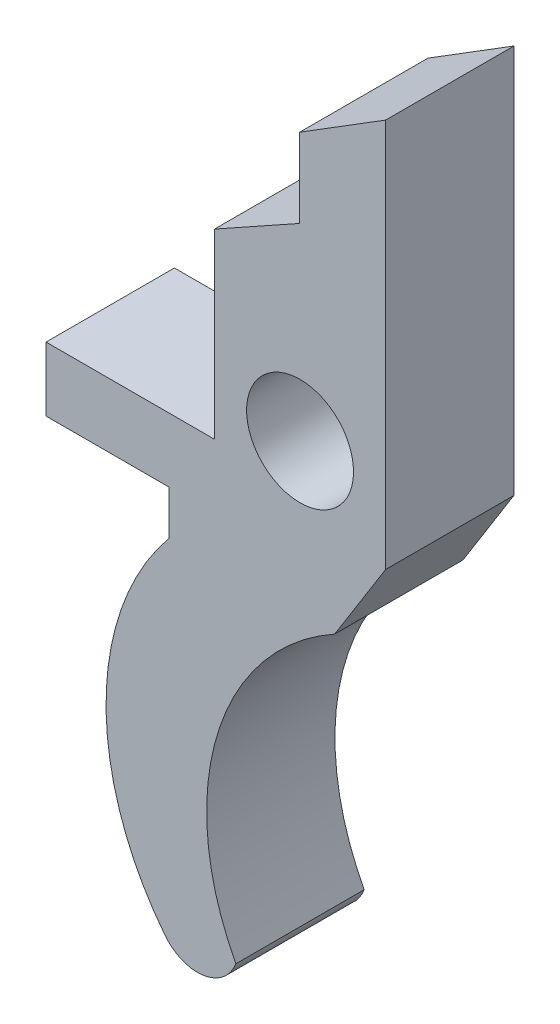
ISO-10303-21;
HEADER;
FILE_DESCRIPTION(('STEP AP214'),'2;1');
FILE_NAME('part.step','',(''),(''),'','','');
FILE_SCHEMA(('AUTOMOTIVE_DESIGN { 1 0 10303 214 1 1 1 1 }'));
ENDSEC;
DATA;
#1=APPLICATION_CONTEXT('core data for automotive mechanical design processes');
#2=APPLICATION_PROTOCOL_DEFINITION('international standard','automotive_design',2000,#1);
#3=PRODUCT_CONTEXT('',#1,'mechanical');
#4=PRODUCT('Part','Part','',(#3));
#5=PRODUCT_RELATED_PRODUCT_CATEGORY('part','',(#4));
#6=PRODUCT_DEFINITION_FORMATION('','',#4);
#7=PRODUCT_DEFINITION_CONTEXT('part definition',#1,'design');
#8=PRODUCT_DEFINITION('design','',#6,#7);
#9=PRODUCT_DEFINITION_SHAPE('','',#8);
#10=(LENGTH_UNIT() NAMED_UNIT(*) SI_UNIT(.MILLI.,.METRE.));
#11=(NAMED_UNIT(*) PLANE_ANGLE_UNIT() SI_UNIT($,.RADIAN.));
#12=(NAMED_UNIT(*) SI_UNIT($,.STERADIAN.) SOLID_ANGLE_UNIT());
#13=UNCERTAINTY_MEASURE_WITH_UNIT(LENGTH_MEASURE(1.E-05),#10,'distance_accuracy_value','');
#14=(GEOMETRIC_REPRESENTATION_CONTEXT(3) GLOBAL_UNCERTAINTY_ASSIGNED_CONTEXT((#13)) GLOBAL_UNIT_ASSIGNED_CONTEXT((#10,
#11,#12)) REPRESENTATION_CONTEXT('',''));
#15=CARTESIAN_POINT('',(0.,0.,0.));
#16=DIRECTION('',(0.,0.,1.));
#17=DIRECTION('',(1.,0.,0.));
#18=AXIS2_PLACEMENT_3D('',#15,#16,#17);
#19=CARTESIAN_POINT('',(4.,0.,6.));
#20=DIRECTION('',(1.,0.,0.));
#21=DIRECTION('',(0.,1.,0.));
#22=AXIS2_PLACEMENT_3D('',#19,#20,#21);
#23=PLANE('',#22);
#24=DIRECTION('',(0.,-1.,0.));
#25=VECTOR('',#24,1.);
#26=CARTESIAN_POINT('',(4.,0.,0.));
#27=LINE('',#26,#25);
#28=CARTESIAN_POINT('',(4.,15.,0.));
#29=VERTEX_POINT('',#28);
#30=CARTESIAN_POINT('',(4.,-3.20232898260396,0.));
#31=VERTEX_POINT('',#30);
#32=EDGE_CURVE('E162',#29,#31,#27,.T.);
#33=ORIENTED_EDGE('',*,*,#32,.F.);
#34=DIRECTION('',(0.,0.,-1.));
#35=VECTOR('',#34,1.);
#36=CARTESIAN_POINT('',(4.,15.,6.));
#37=LINE('',#36,#35);
#38=CARTESIAN_POINT('',(4.,15.,6.));
#39=VERTEX_POINT('',#38);
#40=EDGE_CURVE('E11',#39,#29,#37,.T.);
#41=ORIENTED_EDGE('',*,*,#40,.F.);
#42=DIRECTION('',(0.,-1.,0.));
#43=VECTOR('',#42,1.);
#44=CARTESIAN_POINT('',(4.,0.,6.));
#45=LINE('',#44,#43);
#46=CARTESIAN_POINT('',(4.,-3.20232898260396,6.));
#47=VERTEX_POINT('',#46);
#48=EDGE_CURVE('E199',#39,#47,#45,.T.);
#49=ORIENTED_EDGE('',*,*,#48,.T.);
#50=DIRECTION('',(0.,0.,-1.));
#51=VECTOR('',#50,1.);
#52=CARTESIAN_POINT('',(4.,-3.20232898260396,6.));
#53=LINE('',#52,#51);
#54=EDGE_CURVE('E50',#47,#31,#53,.T.);
#55=ORIENTED_EDGE('',*,*,#54,.T.);
#56=EDGE_LOOP('',(#33,#41,#49,#55));
#57=FACE_BOUND('',#56,.T.);
#58=ADVANCED_FACE('F34',(#57),#23,.T.);
#59=CARTESIAN_POINT('',(-5.61176994680407,9.02018363263467,6.));
#60=DIRECTION('',(-0.528248360907939,0.849089906428098,0.));
#61=DIRECTION('',(-0.849089906428098,-0.528248360907939,0.));
#62=AXIS2_PLACEMENT_3D('',#59,#60,#61);
#63=PLANE('',#62);
#64=DIRECTION('',(0.849089906428098,0.528248360907939,0.));
#65=VECTOR('',#64,1.);
#66=CARTESIAN_POINT('',(-5.61176994680407,9.02018363263467,0.));
#67=LINE('',#66,#65);
#68=CARTESIAN_POINT('',(-0.018657752950472,12.4998532487845,0.));
#69=VERTEX_POINT('',#68);
#70=EDGE_CURVE('E164',#69,#29,#67,.T.);
#71=ORIENTED_EDGE('',*,*,#70,.F.);
#72=DIRECTION('',(0.,0.,-1.));
#73=VECTOR('',#72,1.);
#74=CARTESIAN_POINT('',(-0.018657752950472,12.4998532487845,6.));
#75=LINE('',#74,#73);
#76=CARTESIAN_POINT('',(-0.018657752950472,12.4998532487845,6.));
#77=VERTEX_POINT('',#76);
#78=EDGE_CURVE('E42',#77,#69,#75,.T.);
#79=ORIENTED_EDGE('',*,*,#78,.F.);
#80=DIRECTION('',(0.849089906428098,0.528248360907939,0.));
#81=VECTOR('',#80,1.);
#82=CARTESIAN_POINT('',(-5.61176994680407,9.02018363263467,6.));
#83=LINE('',#82,#81);
#84=EDGE_CURVE('E239',#77,#39,#83,.T.);
#85=ORIENTED_EDGE('',*,*,#84,.T.);
#86=ORIENTED_EDGE('',*,*,#40,.T.);
#87=EDGE_LOOP('',(#71,#79,#85,#86));
#88=FACE_BOUND('',#87,.T.);
#89=ADVANCED_FACE('F226',(#88),#63,.T.);
#90=CARTESIAN_POINT('',(-0.0186577529504716,0.,6.));
#91=DIRECTION('',(-1.,0.,0.));
#92=DIRECTION('',(0.,0.,1.));
#93=AXIS2_PLACEMENT_3D('',#90,#91,#92);
#94=PLANE('',#93);
#95=DIRECTION('',(0.,1.,0.));
#96=VECTOR('',#95,1.);
#97=CARTESIAN_POINT('',(-0.0186577529504716,0.,0.));
#98=LINE('',#97,#96);
#99=CARTESIAN_POINT('',(-0.0186577529504711,8.8049252934806,0.));
#100=VERTEX_POINT('',#99);
#101=EDGE_CURVE('E167',#100,#69,#98,.T.);
#102=ORIENTED_EDGE('',*,*,#101,.F.);
#103=DIRECTION('',(0.,0.,-1.));
#104=VECTOR('',#103,1.);
#105=CARTESIAN_POINT('',(-0.0186577529504711,8.8049252934806,6.));
#106=LINE('',#105,#104);
#107=CARTESIAN_POINT('',(-0.0186577529504711,8.8049252934806,6.));
#108=VERTEX_POINT('',#107);
#109=EDGE_CURVE('E215',#108,#100,#106,.T.);
#110=ORIENTED_EDGE('',*,*,#109,.F.);
#111=DIRECTION('',(0.,1.,0.));
#112=VECTOR('',#111,1.);
#113=CARTESIAN_POINT('',(-0.0186577529504716,0.,6.));
#114=LINE('',#113,#112);
#115=EDGE_CURVE('E222',#108,#77,#114,.T.);
#116=ORIENTED_EDGE('',*,*,#115,.T.);
#117=ORIENTED_EDGE('',*,*,#78,.T.);
#118=EDGE_LOOP('',(#102,#110,#116,#117));
#119=FACE_BOUND('',#118,.T.);
#120=ADVANCED_FACE('F220',(#119),#94,.T.);
#121=CARTESIAN_POINT('',(-3.74872604663077,6.7259671523767,6.));
#122=DIRECTION('',(-0.486841047184989,0.873490580816888,0.));
#123=DIRECTION('',(-0.873490580816888,-0.486841047184989,0.));
#124=AXIS2_PLACEMENT_3D('',#121,#122,#123);
#125=PLANE('',#124);
#126=DIRECTION('',(0.873490580816888,0.486841047184989,0.));
#127=VECTOR('',#126,1.);
#128=CARTESIAN_POINT('',(-3.74872604663077,6.7259671523767,0.));
#129=LINE('',#128,#127);
#130=CARTESIAN_POINT('',(-4.,6.58591930609748,0.));
#131=VERTEX_POINT('',#130);
#132=EDGE_CURVE('E170',#131,#100,#129,.T.);
#133=ORIENTED_EDGE('',*,*,#132,.F.);
#134=DIRECTION('',(0.,0.,-1.));
#135=VECTOR('',#134,1.);
#136=CARTESIAN_POINT('',(-4.,6.58591930609748,6.));
#137=LINE('',#136,#135);
#138=CARTESIAN_POINT('',(-4.,6.58591930609748,6.));
#139=VERTEX_POINT('',#138);
#140=EDGE_CURVE('E213',#139,#131,#137,.T.);
#141=ORIENTED_EDGE('',*,*,#140,.F.);
#142=DIRECTION('',(0.873490580816888,0.486841047184989,0.));
#143=VECTOR('',#142,1.);
#144=CARTESIAN_POINT('',(-3.74872604663077,6.7259671523767,6.));
#145=LINE('',#144,#143);
#146=EDGE_CURVE('E236',#139,#108,#145,.T.);
#147=ORIENTED_EDGE('',*,*,#146,.T.);
#148=ORIENTED_EDGE('',*,*,#109,.T.);
#149=EDGE_LOOP('',(#133,#141,#147,#148));
#150=FACE_BOUND('',#149,.T.);
#151=ADVANCED_FACE('F233',(#150),#125,.T.);
#152=CARTESIAN_POINT('',(-4.,0.,6.));
#153=DIRECTION('',(-1.,0.,0.));
#154=DIRECTION('',(0.,0.,1.));
#155=AXIS2_PLACEMENT_3D('',#152,#153,#154);
#156=PLANE('',#155);
#157=DIRECTION('',(0.,1.,0.));
#158=VECTOR('',#157,1.);
#159=CARTESIAN_POINT('',(-4.,0.,0.));
#160=LINE('',#159,#158);
#161=CARTESIAN_POINT('',(-4.,-1.92801779693598,0.));
#162=VERTEX_POINT('',#161);
#163=EDGE_CURVE('E173',#162,#131,#160,.T.);
#164=ORIENTED_EDGE('',*,*,#163,.F.);
#165=DIRECTION('',(0.,0.,-1.));
#166=VECTOR('',#165,1.);
#167=CARTESIAN_POINT('',(-4.,-1.92801779693598,6.));
#168=LINE('',#167,#166);
#169=CARTESIAN_POINT('',(-4.,-1.92801779693598,6.));
#170=VERTEX_POINT('',#169);
#171=EDGE_CURVE('E211',#170,#162,#168,.T.);
#172=ORIENTED_EDGE('',*,*,#171,.F.);
#173=DIRECTION('',(0.,1.,0.));
#174=VECTOR('',#173,1.);
#175=CARTESIAN_POINT('',(-4.,0.,6.));
#176=LINE('',#175,#174);
#177=EDGE_CURVE('E241',#170,#139,#176,.T.);
#178=ORIENTED_EDGE('',*,*,#177,.T.);
#179=ORIENTED_EDGE('',*,*,#140,.T.);
#180=EDGE_LOOP('',(#164,#172,#178,#179));
#181=FACE_BOUND('',#180,.T.);
#182=ADVANCED_FACE('F380',(#181),#156,.T.);
#183=CARTESIAN_POINT('',(0.,-1.92801779693598,6.));
#184=DIRECTION('',(0.,1.,0.));
#185=DIRECTION('',(0.,0.,1.));
#186=AXIS2_PLACEMENT_3D('',#183,#184,#185);
#187=PLANE('',#186);
#188=DIRECTION('',(1.,0.,0.));
#189=VECTOR('',#188,1.);
#190=CARTESIAN_POINT('',(0.,-1.92801779693598,0.));
#191=LINE('',#190,#189);
#192=CARTESIAN_POINT('',(-11.8770683006772,-1.92801779693598,0.));
#193=VERTEX_POINT('',#192);
#194=EDGE_CURVE('E176',#193,#162,#191,.T.);
#195=ORIENTED_EDGE('',*,*,#194,.F.);
#196=DIRECTION('',(0.,0.,-1.));
#197=VECTOR('',#196,1.);
#198=CARTESIAN_POINT('',(-11.8770683006772,-1.92801779693598,6.));
#199=LINE('',#198,#197);
#200=CARTESIAN_POINT('',(-11.8770683006772,-1.92801779693598,6.));
#201=VERTEX_POINT('',#200);
#202=EDGE_CURVE('E209',#201,#193,#199,.T.);
#203=ORIENTED_EDGE('',*,*,#202,.F.);
#204=DIRECTION('',(1.,0.,0.));
#205=VECTOR('',#204,1.);
#206=CARTESIAN_POINT('',(0.,-1.92801779693598,6.));
#207=LINE('',#206,#205);
#208=EDGE_CURVE('E247',#201,#170,#207,.T.);
#209=ORIENTED_EDGE('',*,*,#208,.T.);
#210=ORIENTED_EDGE('',*,*,#171,.T.);
#211=EDGE_LOOP('',(#195,#203,#209,#210));
#212=FACE_BOUND('',#211,.T.);
#213=ADVANCED_FACE('F371',(#212),#187,.T.);
#214=CARTESIAN_POINT('',(-11.8770683006772,0.,6.));
#215=DIRECTION('',(-1.,0.,0.));
#216=DIRECTION('',(0.,0.,1.));
#217=AXIS2_PLACEMENT_3D('',#214,#215,#216);
#218=PLANE('',#217);
#219=DIRECTION('',(0.,1.,0.));
#220=VECTOR('',#219,1.);
#221=CARTESIAN_POINT('',(-11.8770683006772,0.,0.));
#222=LINE('',#221,#220);
#223=CARTESIAN_POINT('',(-11.8770683006772,-4.92801779693598,0.));
#224=VERTEX_POINT('',#223);
#225=EDGE_CURVE('E179',#224,#193,#222,.T.);
#226=ORIENTED_EDGE('',*,*,#225,.F.);
#227=DIRECTION('',(0.,0.,-1.));
#228=VECTOR('',#227,1.);
#229=CARTESIAN_POINT('',(-11.8770683006772,-4.92801779693598,6.));
#230=LINE('',#229,#228);
#231=CARTESIAN_POINT('',(-11.8770683006772,-4.92801779693598,6.));
#232=VERTEX_POINT('',#231);
#233=EDGE_CURVE('E207',#232,#224,#230,.T.);
#234=ORIENTED_EDGE('',*,*,#233,.F.);
#235=DIRECTION('',(0.,1.,0.));
#236=VECTOR('',#235,1.);
#237=CARTESIAN_POINT('',(-11.8770683006772,0.,6.));
#238=LINE('',#237,#236);
#239=EDGE_CURVE('E250',#232,#201,#238,.T.);
#240=ORIENTED_EDGE('',*,*,#239,.T.);
#241=ORIENTED_EDGE('',*,*,#202,.T.);
#242=EDGE_LOOP('',(#226,#234,#240,#241));
#243=FACE_BOUND('',#242,.T.);
#244=ADVANCED_FACE('F363',(#243),#218,.T.);
#245=CARTESIAN_POINT('',(0.,-4.92801779693598,6.));
#246=DIRECTION('',(0.,-1.,0.));
#247=DIRECTION('',(1.,0.,0.));
#248=AXIS2_PLACEMENT_3D('',#245,#246,#247);
#249=PLANE('',#248);
#250=DIRECTION('',(-1.,0.,0.));
#251=VECTOR('',#250,1.);
#252=CARTESIAN_POINT('',(0.,-4.92801779693598,0.));
#253=LINE('',#252,#251);
#254=CARTESIAN_POINT('',(-6.12956888964789,-4.92801779693598,0.));
#255=VERTEX_POINT('',#254);
#256=EDGE_CURVE('E182',#255,#224,#253,.T.);
#257=ORIENTED_EDGE('',*,*,#256,.F.);
#258=DIRECTION('',(0.,0.,-1.));
#259=VECTOR('',#258,1.);
#260=CARTESIAN_POINT('',(-6.12956888964789,-4.92801779693598,6.));
#261=LINE('',#260,#259);
#262=CARTESIAN_POINT('',(-6.12956888964789,-4.92801779693598,6.));
#263=VERTEX_POINT('',#262);
#264=EDGE_CURVE('E205',#263,#255,#261,.T.);
#265=ORIENTED_EDGE('',*,*,#264,.F.);
#266=DIRECTION('',(-1.,0.,0.));
#267=VECTOR('',#266,1.);
#268=CARTESIAN_POINT('',(0.,-4.92801779693598,6.));
#269=LINE('',#268,#267);
#270=EDGE_CURVE('E253',#263,#232,#269,.T.);
#271=ORIENTED_EDGE('',*,*,#270,.T.);
#272=ORIENTED_EDGE('',*,*,#233,.T.);
#273=EDGE_LOOP('',(#257,#265,#271,#272));
#274=FACE_BOUND('',#273,.T.);
#275=ADVANCED_FACE('F266',(#274),#249,.T.);
#276=CARTESIAN_POINT('',(-6.12956888964789,0.,6.));
#277=DIRECTION('',(-1.,0.,0.));
#278=DIRECTION('',(0.,0.,1.));
#279=AXIS2_PLACEMENT_3D('',#276,#277,#278);
#280=PLANE('',#279);
#281=DIRECTION('',(0.,1.,0.));
#282=VECTOR('',#281,1.);
#283=CARTESIAN_POINT('',(-6.12956888964789,0.,0.));
#284=LINE('',#283,#282);
#285=CARTESIAN_POINT('',(-6.12956888964789,-7.00588498861876,0.));
#286=VERTEX_POINT('',#285);
#287=EDGE_CURVE('E185',#286,#255,#284,.T.);
#288=ORIENTED_EDGE('',*,*,#287,.F.);
#289=DIRECTION('',(0.,0.,-1.));
#290=VECTOR('',#289,1.);
#291=CARTESIAN_POINT('',(-6.12956888964789,-7.00588498861876,6.));
#292=LINE('',#291,#290);
#293=CARTESIAN_POINT('',(-6.12956888964789,-7.00588498861876,6.));
#294=VERTEX_POINT('',#293);
#295=EDGE_CURVE('E203',#294,#286,#292,.T.);
#296=ORIENTED_EDGE('',*,*,#295,.F.);
#297=DIRECTION('',(0.,1.,0.));
#298=VECTOR('',#297,1.);
#299=CARTESIAN_POINT('',(-6.12956888964789,0.,6.));
#300=LINE('',#299,#298);
#301=EDGE_CURVE('E256',#294,#263,#300,.T.);
#302=ORIENTED_EDGE('',*,*,#301,.T.);
#303=ORIENTED_EDGE('',*,*,#264,.T.);
#304=EDGE_LOOP('',(#288,#296,#302,#303));
#305=FACE_BOUND('',#304,.T.);
#306=ADVANCED_FACE('F260',(#305),#280,.T.);
#307=CARTESIAN_POINT('',(3.81433781673732,-15.204075700018,6.));
#308=DIRECTION('',(0.,0.,-1.));
#309=DIRECTION('',(-1.,0.,0.));
#310=AXIS2_PLACEMENT_3D('',#307,#308,#309);
#311=CYLINDRICAL_SURFACE('',#310,12.8876534530443);
#312=CARTESIAN_POINT('',(3.81433781673732,-15.204075700018,0.));
#313=DIRECTION('',(0.,0.,1.));
#314=DIRECTION('',(1.,0.,0.));
#315=AXIS2_PLACEMENT_3D('',#312,#313,#314);
#316=CIRCLE('',#315,12.8876534530443);
#317=CARTESIAN_POINT('',(-6.3027077759285,-23.187621278374,0.));
#318=VERTEX_POINT('',#317);
#319=EDGE_CURVE('E188',#286,#318,#316,.T.);
#320=ORIENTED_EDGE('',*,*,#319,.T.);
#321=DIRECTION('',(0.,0.,-1.));
#322=VECTOR('',#321,1.);
#323=CARTESIAN_POINT('',(-6.3027077759285,-23.187621278374,6.));
#324=LINE('',#323,#322);
#325=CARTESIAN_POINT('',(-6.3027077759285,-23.187621278374,6.));
#326=VERTEX_POINT('',#325);
#327=EDGE_CURVE('E151',#326,#318,#324,.T.);
#328=ORIENTED_EDGE('',*,*,#327,.F.);
#329=CARTESIAN_POINT('',(3.81433781673732,-15.204075700018,6.));
#330=DIRECTION('',(0.,0.,1.));
#331=DIRECTION('',(1.,0.,0.));
#332=AXIS2_PLACEMENT_3D('',#329,#330,#331);
#333=CIRCLE('',#332,12.8876534530443);
#334=EDGE_CURVE('E139',#294,#326,#333,.T.);
#335=ORIENTED_EDGE('',*,*,#334,.F.);
#336=ORIENTED_EDGE('',*,*,#295,.T.);
#337=EDGE_LOOP('',(#320,#328,#335,#336));
#338=FACE_BOUND('',#337,.T.);
#339=ADVANCED_FACE('F270',(#338),#311,.T.);
#340=CARTESIAN_POINT('',(-4.79732713344712,-21.9996979007491,6.));
#341=DIRECTION('',(0.,0.,-1.));
#342=DIRECTION('',(-1.,0.,0.));
#343=AXIS2_PLACEMENT_3D('',#340,#341,#342);
#344=CYLINDRICAL_SURFACE('',#343,1.91763730404512);
#345=CARTESIAN_POINT('',(-4.79732713344712,-21.9996979007491,0.));
#346=DIRECTION('',(0.,0.,1.));
#347=DIRECTION('',(1.,0.,0.));
#348=AXIS2_PLACEMENT_3D('',#345,#346,#347);
#349=CIRCLE('',#348,1.91763730404512);
#350=CARTESIAN_POINT('',(-2.99999999841277,-22.6682395969316,0.));
#351=VERTEX_POINT('',#350);
#352=EDGE_CURVE('E148',#318,#351,#349,.T.);
#353=ORIENTED_EDGE('',*,*,#352,.T.);
#354=DIRECTION('',(0.,0.,-1.));
#355=VECTOR('',#354,1.);
#356=CARTESIAN_POINT('',(-2.99999999841277,-22.6682395969316,6.));
#357=LINE('',#356,#355);
#358=CARTESIAN_POINT('',(-2.99999999841277,-22.6682395969316,6.));
#359=VERTEX_POINT('',#358);
#360=EDGE_CURVE('E145',#359,#351,#357,.T.);
#361=ORIENTED_EDGE('',*,*,#360,.F.);
#362=CARTESIAN_POINT('',(-4.79732713344712,-21.9996979007491,6.));
#363=DIRECTION('',(0.,0.,1.));
#364=DIRECTION('',(1.,0.,0.));
#365=AXIS2_PLACEMENT_3D('',#362,#363,#364);
#366=CIRCLE('',#365,1.91763730404512);
#367=EDGE_CURVE('E130',#326,#359,#366,.T.);
#368=ORIENTED_EDGE('',*,*,#367,.F.);
#369=ORIENTED_EDGE('',*,*,#327,.T.);
#370=EDGE_LOOP('',(#353,#361,#368,#369));
#371=FACE_BOUND('',#370,.T.);
#372=ADVANCED_FACE('F146',(#371),#344,.T.);
#373=CARTESIAN_POINT('',(7.28356039494337,-17.188693797444,6.));
#374=DIRECTION('',(0.,0.,-1.));
#375=DIRECTION('',(-1.,0.,0.));
#376=AXIS2_PLACEMENT_3D('',#373,#374,#375);
#377=CYLINDRICAL_SURFACE('',#376,11.6523403886295);
#378=CARTESIAN_POINT('',(7.28356039494337,-17.188693797444,0.));
#379=DIRECTION('',(0.,0.,1.));
#380=DIRECTION('',(1.,0.,0.));
#381=AXIS2_PLACEMENT_3D('',#378,#379,#380);
#382=CIRCLE('',#381,11.6523403886295);
#383=CARTESIAN_POINT('',(1.61898262644221,-7.00588498861876,0.));
#384=VERTEX_POINT('',#383);
#385=EDGE_CURVE('E191',#384,#351,#382,.T.);
#386=ORIENTED_EDGE('',*,*,#385,.F.);
#387=DIRECTION('',(0.,0.,-1.));
#388=VECTOR('',#387,1.);
#389=CARTESIAN_POINT('',(1.61898262644221,-7.00588498861876,6.));
#390=LINE('',#389,#388);
#391=CARTESIAN_POINT('',(1.61898262644221,-7.00588498861876,6.));
#392=VERTEX_POINT('',#391);
#393=EDGE_CURVE('E90',#392,#384,#390,.T.);
#394=ORIENTED_EDGE('',*,*,#393,.F.);
#395=CARTESIAN_POINT('',(7.28356039494337,-17.188693797444,6.));
#396=DIRECTION('',(0.,0.,1.));
#397=DIRECTION('',(1.,0.,0.));
#398=AXIS2_PLACEMENT_3D('',#395,#396,#397);
#399=CIRCLE('',#398,11.6523403886295);
#400=EDGE_CURVE('E136',#392,#359,#399,.T.);
#401=ORIENTED_EDGE('',*,*,#400,.T.);
#402=ORIENTED_EDGE('',*,*,#360,.T.);
#403=EDGE_LOOP('',(#386,#394,#401,#402));
#404=FACE_BOUND('',#403,.T.);
#405=ADVANCED_FACE('F153',(#404),#377,.F.);
#406=CARTESIAN_POINT('',(4.31407895870469,-2.70060357605682,6.));
#407=DIRECTION('',(0.847618004018992,-0.53060693480472,0.));
#408=DIRECTION('',(0.53060693480472,0.847618004018992,0.));
#409=AXIS2_PLACEMENT_3D('',#406,#407,#408);
#410=PLANE('',#409);
#411=DIRECTION('',(-0.53060693480472,-0.847618004018992,0.));
#412=VECTOR('',#411,1.);
#413=CARTESIAN_POINT('',(4.31407895870469,-2.70060357605682,0.));
#414=LINE('',#413,#412);
#415=EDGE_CURVE('E193',#31,#384,#414,.T.);
#416=ORIENTED_EDGE('',*,*,#415,.F.);
#417=ORIENTED_EDGE('',*,*,#54,.F.);
#418=DIRECTION('',(-0.53060693480472,-0.847618004018992,0.));
#419=VECTOR('',#418,1.);
#420=CARTESIAN_POINT('',(4.31407895870469,-2.70060357605682,6.));
#421=LINE('',#420,#419);
#422=EDGE_CURVE('E154',#47,#392,#421,.T.);
#423=ORIENTED_EDGE('',*,*,#422,.T.);
#424=ORIENTED_EDGE('',*,*,#393,.T.);
#425=EDGE_LOOP('',(#416,#417,#423,#424));
#426=FACE_BOUND('',#425,.T.);
#427=ADVANCED_FACE('F283',(#426),#410,.T.);
#428=CARTESIAN_POINT('',(0.,0.,6.));
#429=DIRECTION('',(0.,0.,-1.));
#430=DIRECTION('',(-1.,0.,0.));
#431=AXIS2_PLACEMENT_3D('',#428,#429,#430);
#432=CYLINDRICAL_SURFACE('',#431,2.5);
#433=CARTESIAN_POINT('',(0.,0.,6.));
#434=DIRECTION('',(0.,0.,1.));
#435=DIRECTION('',(1.,0.,0.));
#436=AXIS2_PLACEMENT_3D('',#433,#434,#435);
#437=CIRCLE('',#436,2.5);
#438=CARTESIAN_POINT('',(2.5,0.,6.));
#439=VERTEX_POINT('',#438);
#440=EDGE_CURVE('E156',#439,#439,#437,.T.);
#441=ORIENTED_EDGE('',*,*,#440,.T.);
#442=EDGE_LOOP('',(#441));
#443=FACE_BOUND('',#442,.T.);
#444=CARTESIAN_POINT('',(0.,0.,0.));
#445=DIRECTION('',(0.,0.,1.));
#446=DIRECTION('',(1.,0.,0.));
#447=AXIS2_PLACEMENT_3D('',#444,#445,#446);
#448=CIRCLE('',#447,2.5);
#449=CARTESIAN_POINT('',(2.5,0.,0.));
#450=VERTEX_POINT('',#449);
#451=EDGE_CURVE('E196',#450,#450,#448,.T.);
#452=ORIENTED_EDGE('',*,*,#451,.F.);
#453=EDGE_LOOP('',(#452));
#454=FACE_BOUND('',#453,.T.);
#455=ADVANCED_FACE('F285',(#443,#454),#432,.F.);
#456=CARTESIAN_POINT('',(0.,0.,6.));
#457=DIRECTION('',(0.,0.,1.));
#458=DIRECTION('',(1.,0.,0.));
#459=AXIS2_PLACEMENT_3D('',#456,#457,#458);
#460=PLANE('',#459);
#461=ORIENTED_EDGE('',*,*,#48,.F.);
#462=ORIENTED_EDGE('',*,*,#84,.F.);
#463=ORIENTED_EDGE('',*,*,#115,.F.);
#464=ORIENTED_EDGE('',*,*,#146,.F.);
#465=ORIENTED_EDGE('',*,*,#177,.F.);
#466=ORIENTED_EDGE('',*,*,#208,.F.);
#467=ORIENTED_EDGE('',*,*,#239,.F.);
#468=ORIENTED_EDGE('',*,*,#270,.F.);
#469=ORIENTED_EDGE('',*,*,#301,.F.);
#470=ORIENTED_EDGE('',*,*,#334,.T.);
#471=ORIENTED_EDGE('',*,*,#367,.T.);
#472=ORIENTED_EDGE('',*,*,#400,.F.);
#473=ORIENTED_EDGE('',*,*,#422,.F.);
#474=EDGE_LOOP('',(#461,#462,#463,#464,#465,#466,#467,#468,#469,#470,#471,#472,#473));
#475=FACE_BOUND('',#474,.T.);
#476=ORIENTED_EDGE('',*,*,#440,.F.);
#477=EDGE_LOOP('',(#476));
#478=FACE_BOUND('',#477,.T.);
#479=ADVANCED_FACE('F132',(#475,#478),#460,.T.);
#480=CARTESIAN_POINT('',(0.,0.,0.));
#481=DIRECTION('',(0.,0.,1.));
#482=DIRECTION('',(1.,0.,0.));
#483=AXIS2_PLACEMENT_3D('',#480,#481,#482);
#484=PLANE('',#483);
#485=ORIENTED_EDGE('',*,*,#32,.T.);
#486=ORIENTED_EDGE('',*,*,#415,.T.);
#487=ORIENTED_EDGE('',*,*,#385,.T.);
#488=ORIENTED_EDGE('',*,*,#352,.F.);
#489=ORIENTED_EDGE('',*,*,#319,.F.);
#490=ORIENTED_EDGE('',*,*,#287,.T.);
#491=ORIENTED_EDGE('',*,*,#256,.T.);
#492=ORIENTED_EDGE('',*,*,#225,.T.);
#493=ORIENTED_EDGE('',*,*,#194,.T.);
#494=ORIENTED_EDGE('',*,*,#163,.T.);
#495=ORIENTED_EDGE('',*,*,#132,.T.);
#496=ORIENTED_EDGE('',*,*,#101,.T.);
#497=ORIENTED_EDGE('',*,*,#70,.T.);
#498=EDGE_LOOP('',(#485,#486,#487,#488,#489,#490,#491,#492,#493,#494,#495,#496,#497));
#499=FACE_BOUND('',#498,.T.);
#500=ORIENTED_EDGE('',*,*,#451,.T.);
#501=EDGE_LOOP('',(#500));
#502=FACE_BOUND('',#501,.T.);
#503=ADVANCED_FACE('F228',(#499,#502),#484,.F.);
#504=CLOSED_SHELL('',(#58,#89,#120,#151,#182,#213,#244,#275,#306,#339,#372,#405,#427,#455,#479,#503));
#505=MANIFOLD_SOLID_BREP('B2',#504);
#506=ADVANCED_BREP_SHAPE_REPRESENTATION('',(#18,#505),#14);
#507=SHAPE_DEFINITION_REPRESENTATION(#9,#506);
ENDSEC;
END-ISO-10303-21;
